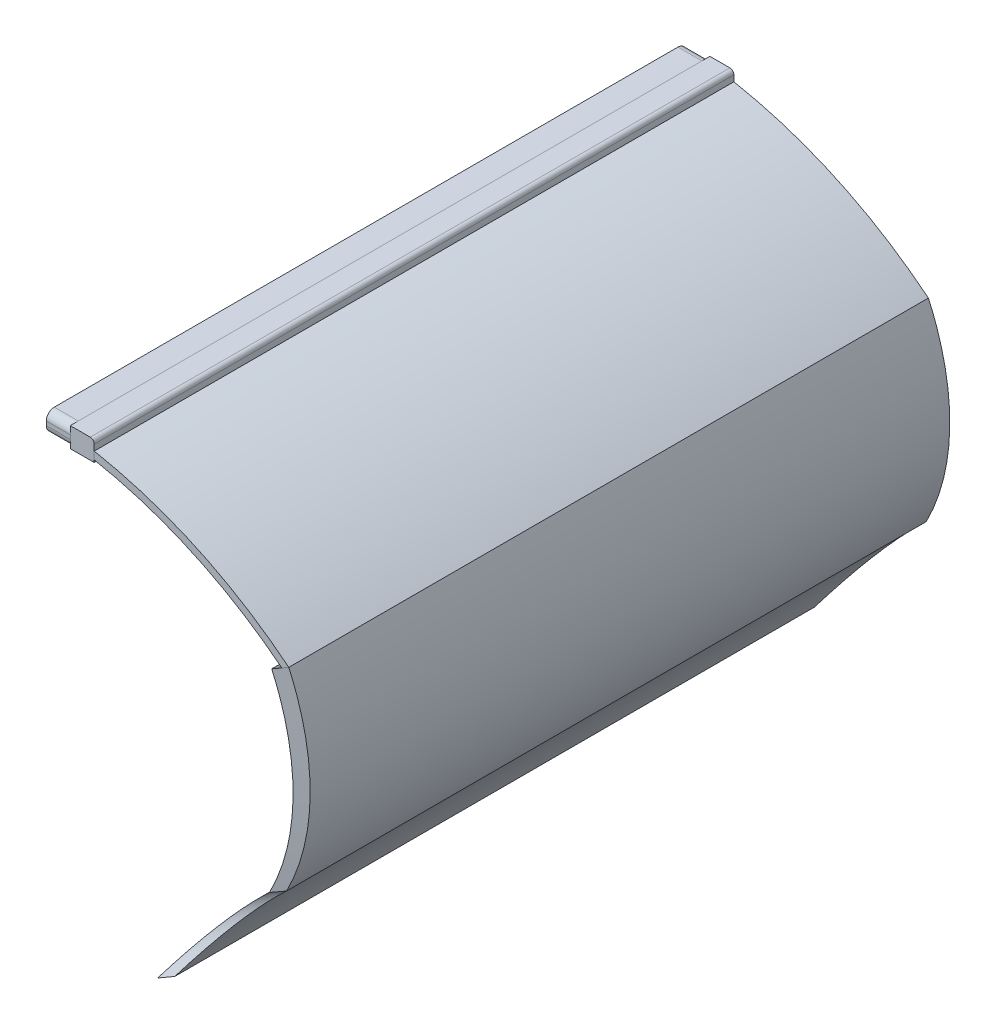
ISO-10303-21;
HEADER;
FILE_DESCRIPTION(('STEP AP214'),'2;1');
FILE_NAME('part.step','',(''),(''),'','','');
FILE_SCHEMA(('AUTOMOTIVE_DESIGN { 1 0 10303 214 1 1 1 1 }'));
ENDSEC;
DATA;
#1=APPLICATION_CONTEXT('core data for automotive mechanical design processes');
#2=APPLICATION_PROTOCOL_DEFINITION('international standard','automotive_design',2000,#1);
#3=PRODUCT_CONTEXT('',#1,'mechanical');
#4=PRODUCT('Part','Part','',(#3));
#5=PRODUCT_RELATED_PRODUCT_CATEGORY('part','',(#4));
#6=PRODUCT_DEFINITION_FORMATION('','',#4);
#7=PRODUCT_DEFINITION_CONTEXT('part definition',#1,'design');
#8=PRODUCT_DEFINITION('design','',#6,#7);
#9=PRODUCT_DEFINITION_SHAPE('','',#8);
#10=(LENGTH_UNIT() NAMED_UNIT(*) SI_UNIT(.MILLI.,.METRE.));
#11=(NAMED_UNIT(*) PLANE_ANGLE_UNIT() SI_UNIT($,.RADIAN.));
#12=(NAMED_UNIT(*) SI_UNIT($,.STERADIAN.) SOLID_ANGLE_UNIT());
#13=UNCERTAINTY_MEASURE_WITH_UNIT(LENGTH_MEASURE(1.E-05),#10,'distance_accuracy_value','');
#14=(GEOMETRIC_REPRESENTATION_CONTEXT(3) GLOBAL_UNCERTAINTY_ASSIGNED_CONTEXT((#13)) GLOBAL_UNIT_ASSIGNED_CONTEXT((#10,
#11,#12)) REPRESENTATION_CONTEXT('',''));
#15=CARTESIAN_POINT('',(0.,0.,0.));
#16=DIRECTION('',(0.,0.,1.));
#17=DIRECTION('',(1.,0.,0.));
#18=AXIS2_PLACEMENT_3D('',#15,#16,#17);
#19=CARTESIAN_POINT('',(26.1376134002085,-78.7658483279663,-80.));
#20=CARTESIAN_POINT('',(29.3737791130142,-73.8210922114999,-82.2996034340908));
#21=CARTESIAN_POINT('',(33.098124046671,-68.8330713909964,-83.8152619703646));
#22=CARTESIAN_POINT('',(41.2157217802528,-59.1820759257835,-85.1538805493582));
#23=CARTESIAN_POINT('',(45.607610375297,-54.5207231816037,-84.9766156301814));
#24=CARTESIAN_POINT('',(50.1514252787619,-50.2158761379638,-83.959956601666));
#25=CARTESIAN_POINT('',(26.1376134002085,-78.7658483279663,80.));
#26=CARTESIAN_POINT('',(29.3737791130142,-73.8210922114999,77.7003965659092));
#27=CARTESIAN_POINT('',(33.098124046671,-68.8330713909964,76.1847380296354));
#28=CARTESIAN_POINT('',(41.2157217802528,-59.1820759257835,74.8461194506418));
#29=CARTESIAN_POINT('',(45.607610375297,-54.5207231816037,75.0233843698186));
#30=CARTESIAN_POINT('',(50.1514252787619,-50.2158761379638,76.0400433983341));
#31=B_SPLINE_SURFACE_WITH_KNOTS('',1,3,((#19,#20,#21,#22,#23,#24),(#25,#26,#27,#28,#29,#30)),
.UNSPECIFIED.,.F.,.F.,.F.,(2,2),(4,2,4),(0.,1.),(0.,0.5,1.),.UNSPECIFIED.);
#32=DIRECTION('',(0.,0.,1.));
#33=VECTOR('',#32,1.);
#34=CARTESIAN_POINT('',(50.1514252787619,-50.2158761379638,76.0400433983341));
#35=LINE('',#34,#33);
#36=CARTESIAN_POINT('',(50.1514252787619,-50.2158761379638,-83.959956601666));
#37=VERTEX_POINT('',#36);
#38=CARTESIAN_POINT('',(50.1514252787619,-50.2158761379638,76.0400433983341));
#39=VERTEX_POINT('',#38);
#40=EDGE_CURVE('E14',#37,#39,#35,.T.);
#41=CARTESIAN_POINT('',(26.1376134002085,-78.7658483279663,-80.));
#42=CARTESIAN_POINT('',(29.3737791130142,-73.8210922114999,-82.2996034340908));
#43=CARTESIAN_POINT('',(33.098124046671,-68.8330713909964,-83.8152619703646));
#44=CARTESIAN_POINT('',(41.2157217802528,-59.1820759257835,-85.1538805493582));
#45=CARTESIAN_POINT('',(45.607610375297,-54.5207231816037,-84.9766156301814));
#46=CARTESIAN_POINT('',(50.1514252787619,-50.2158761379638,-83.959956601666));
#47=B_SPLINE_CURVE_WITH_KNOTS('',3,(#41,#42,#43,#44,#45,#46),.UNSPECIFIED.,.F.,.F.,(4,2,4),(0.,
0.5,1.),.UNSPECIFIED.);
#48=CARTESIAN_POINT('',(26.1376134002085,-78.7658483279663,-80.));
#49=VERTEX_POINT('',#48);
#50=EDGE_CURVE('E92',#49,#37,#47,.T.);
#51=DIRECTION('',(0.,0.,1.));
#52=VECTOR('',#51,1.);
#53=CARTESIAN_POINT('',(26.1376134002085,-78.7658483279663,80.));
#54=LINE('',#53,#52);
#55=CARTESIAN_POINT('',(26.1376134002085,-78.7658483279663,80.));
#56=VERTEX_POINT('',#55);
#57=EDGE_CURVE('E151',#49,#56,#54,.T.);
#58=CARTESIAN_POINT('',(26.1376134002085,-78.7658483279663,80.));
#59=CARTESIAN_POINT('',(29.3737791130142,-73.8210922114999,77.7003965659092));
#60=CARTESIAN_POINT('',(33.098124046671,-68.8330713909964,76.1847380296354));
#61=CARTESIAN_POINT('',(41.2157217802528,-59.1820759257835,74.8461194506418));
#62=CARTESIAN_POINT('',(45.607610375297,-54.5207231816037,75.0233843698186));
#63=CARTESIAN_POINT('',(50.1514252787619,-50.2158761379638,76.0400433983341));
#64=B_SPLINE_CURVE_WITH_KNOTS('',3,(#58,#59,#60,#61,#62,#63),.UNSPECIFIED.,.F.,.F.,(4,2,4),(0.,
0.5,1.),.UNSPECIFIED.);
#65=EDGE_CURVE('E157',#56,#39,#64,.T.);
#66=ORIENTED_EDGE('',*,*,#40,.F.);
#67=ORIENTED_EDGE('',*,*,#50,.F.);
#68=ORIENTED_EDGE('',*,*,#57,.T.);
#69=ORIENTED_EDGE('',*,*,#65,.T.);
#70=EDGE_LOOP('',(#66,#67,#68,#69));
#71=FACE_BOUND('',#70,.T.);
#72=ADVANCED_FACE('F82',(#71),#31,.T.);
#73=CARTESIAN_POINT('',(21.8623865997916,-81.2341516720336,-80.));
#74=CARTESIAN_POINT('',(25.0985523125973,-76.2893955555673,-82.2996034340908));
#75=CARTESIAN_POINT('',(28.822897246254,-71.3013747350638,-83.8152619703646));
#76=CARTESIAN_POINT('',(36.9404949798359,-61.6503792698509,-85.1538805493582));
#77=CARTESIAN_POINT('',(41.3323835748373,-56.9890265256236,-84.976615630191));
#78=CARTESIAN_POINT('',(45.876198478345,-52.6841794820312,-83.959956601666));
#79=CARTESIAN_POINT('',(26.1376134002085,-78.7658483279663,-80.));
#80=CARTESIAN_POINT('',(29.3737791130142,-73.8210922114999,-82.2996034340908));
#81=CARTESIAN_POINT('',(33.098124046671,-68.8330713909964,-83.8152619703646));
#82=CARTESIAN_POINT('',(41.2157217802528,-59.1820759257835,-85.1538805493582));
#83=CARTESIAN_POINT('',(45.607610375297,-54.5207231816037,-84.9766156301814));
#84=CARTESIAN_POINT('',(50.1514252787619,-50.2158761379638,-83.959956601666));
#85=B_SPLINE_SURFACE_WITH_KNOTS('',1,3,((#73,#74,#75,#76,#77,#78),(#79,#80,#81,#82,#83,#84)),
.UNSPECIFIED.,.F.,.F.,.F.,(2,2),(4,2,4),(0.,1.),(0.,0.5,1.),.UNSPECIFIED.);
#86=DIRECTION('',(0.866025403784442,0.499999999999994,0.));
#87=VECTOR('',#86,1.);
#88=CARTESIAN_POINT('',(50.1514252787619,-50.2158761379638,-83.959956601666));
#89=LINE('',#88,#87);
#90=CARTESIAN_POINT('',(45.876198478345,-52.6841794820312,-83.959956601666));
#91=VERTEX_POINT('',#90);
#92=EDGE_CURVE('E101',#91,#37,#89,.T.);
#93=CARTESIAN_POINT('',(21.8623865997916,-81.2341516720336,-80.));
#94=CARTESIAN_POINT('',(25.0985523125973,-76.2893955555673,-82.2996034340908));
#95=CARTESIAN_POINT('',(28.822897246254,-71.3013747350638,-83.8152619703646));
#96=CARTESIAN_POINT('',(36.9404949798359,-61.6503792698509,-85.1538805493582));
#97=CARTESIAN_POINT('',(41.3323835748801,-56.9890265256711,-84.9766156301814));
#98=CARTESIAN_POINT('',(45.876198478345,-52.6841794820312,-83.959956601666));
#99=B_SPLINE_CURVE_WITH_KNOTS('',3,(#93,#94,#95,#96,#97,#98),.UNSPECIFIED.,.F.,.F.,(4,2,4),(0.,
0.5,1.),.UNSPECIFIED.);
#100=CARTESIAN_POINT('',(21.8623865997916,-81.2341516720336,-80.));
#101=VERTEX_POINT('',#100);
#102=EDGE_CURVE('E149',#101,#91,#99,.T.);
#103=DIRECTION('',(0.866025403784442,0.499999999999994,0.));
#104=VECTOR('',#103,1.);
#105=CARTESIAN_POINT('',(26.1376134002085,-78.7658483279663,-80.));
#106=LINE('',#105,#104);
#107=EDGE_CURVE('E145',#101,#49,#106,.T.);
#108=ORIENTED_EDGE('',*,*,#50,.T.);
#109=ORIENTED_EDGE('',*,*,#92,.F.);
#110=ORIENTED_EDGE('',*,*,#102,.F.);
#111=ORIENTED_EDGE('',*,*,#107,.T.);
#112=EDGE_LOOP('',(#108,#109,#110,#111));
#113=FACE_BOUND('',#112,.T.);
#114=ADVANCED_FACE('F147',(#113),#85,.T.);
#115=CARTESIAN_POINT('',(21.8623865997916,-81.2341516720336,80.));
#116=CARTESIAN_POINT('',(25.0985523125973,-76.2893955555673,77.7003965659092));
#117=CARTESIAN_POINT('',(28.822897246254,-71.3013747350638,76.1847380296354));
#118=CARTESIAN_POINT('',(36.9404949798359,-61.6503792698509,74.8461194506418));
#119=CARTESIAN_POINT('',(41.3323835748801,-56.9890265256711,75.0233843698186));
#120=CARTESIAN_POINT('',(45.876198478345,-52.6841794820312,76.0400433983341));
#121=CARTESIAN_POINT('',(21.8623865997916,-81.2341516720336,-80.));
#122=CARTESIAN_POINT('',(25.0985523125973,-76.2893955555673,-82.2996034340908));
#123=CARTESIAN_POINT('',(28.822897246254,-71.3013747350638,-83.8152619703646));
#124=CARTESIAN_POINT('',(36.9404949798359,-61.6503792698509,-85.1538805493582));
#125=CARTESIAN_POINT('',(41.3323835748801,-56.9890265256711,-84.9766156301814));
#126=CARTESIAN_POINT('',(45.876198478345,-52.6841794820312,-83.959956601666));
#127=B_SPLINE_SURFACE_WITH_KNOTS('',1,3,((#115,#116,#117,#118,#119,#120),(#121,#122,#123,#124,
#125,#126)),.UNSPECIFIED.,.F.,.F.,.F.,(2,2),(4,2,4),(0.,1.),(0.,0.5,1.),.UNSPECIFIED.);
#128=DIRECTION('',(0.,0.,-1.));
#129=VECTOR('',#128,1.);
#130=CARTESIAN_POINT('',(45.876198478345,-52.6841794820312,76.0400433983341));
#131=LINE('',#130,#129);
#132=CARTESIAN_POINT('',(45.876198478345,-52.6841794820312,76.0400433983341));
#133=VERTEX_POINT('',#132);
#134=EDGE_CURVE('E225',#133,#91,#131,.T.);
#135=CARTESIAN_POINT('',(21.8623865997916,-81.2341516720336,80.));
#136=CARTESIAN_POINT('',(25.0985523125973,-76.2893955555673,77.7003965659092));
#137=CARTESIAN_POINT('',(28.822897246254,-71.3013747350638,76.1847380296354));
#138=CARTESIAN_POINT('',(36.9404949798359,-61.6503792698509,74.8461194506418));
#139=CARTESIAN_POINT('',(41.3323835748373,-56.9890265256236,75.023384369809));
#140=CARTESIAN_POINT('',(45.876198478345,-52.6841794820312,76.0400433983341));
#141=B_SPLINE_CURVE_WITH_KNOTS('',3,(#135,#136,#137,#138,#139,#140),.UNSPECIFIED.,.F.,.F.,(4,2,
4),(0.,0.5,1.),.UNSPECIFIED.);
#142=CARTESIAN_POINT('',(21.8623865997916,-81.2341516720336,80.));
#143=VERTEX_POINT('',#142);
#144=EDGE_CURVE('E221',#143,#133,#141,.T.);
#145=DIRECTION('',(0.,0.,-1.));
#146=VECTOR('',#145,1.);
#147=CARTESIAN_POINT('',(21.8623865997916,-81.2341516720336,80.));
#148=LINE('',#147,#146);
#149=EDGE_CURVE('E139',#143,#101,#148,.T.);
#150=ORIENTED_EDGE('',*,*,#102,.T.);
#151=ORIENTED_EDGE('',*,*,#134,.F.);
#152=ORIENTED_EDGE('',*,*,#144,.F.);
#153=ORIENTED_EDGE('',*,*,#149,.T.);
#154=EDGE_LOOP('',(#150,#151,#152,#153));
#155=FACE_BOUND('',#154,.T.);
#156=ADVANCED_FACE('F242',(#155),#127,.T.);
#157=CARTESIAN_POINT('',(26.1376134002085,-78.7658483279663,80.));
#158=CARTESIAN_POINT('',(29.3737791130142,-73.8210922114999,77.7003965659092));
#159=CARTESIAN_POINT('',(33.098124046671,-68.8330713909964,76.1847380296354));
#160=CARTESIAN_POINT('',(41.2157217802528,-59.1820759257835,74.8461194506418));
#161=CARTESIAN_POINT('',(45.607610375297,-54.5207231816037,75.0233843698186));
#162=CARTESIAN_POINT('',(50.1514252787619,-50.2158761379638,76.0400433983341));
#163=CARTESIAN_POINT('',(21.8623865997916,-81.2341516720336,80.));
#164=CARTESIAN_POINT('',(25.0985523125973,-76.2893955555673,77.7003965659092));
#165=CARTESIAN_POINT('',(28.822897246254,-71.3013747350638,76.1847380296354));
#166=CARTESIAN_POINT('',(36.9404949798359,-61.6503792698509,74.8461194506418));
#167=CARTESIAN_POINT('',(41.3323835748373,-56.9890265256236,75.023384369809));
#168=CARTESIAN_POINT('',(45.876198478345,-52.6841794820312,76.0400433983341));
#169=B_SPLINE_SURFACE_WITH_KNOTS('',1,3,((#157,#158,#159,#160,#161,#162),(#163,#164,#165,#166,
#167,#168)),.UNSPECIFIED.,.F.,.F.,.F.,(2,2),(4,2,4),(0.,1.),(0.,0.5,1.),.UNSPECIFIED.);
#170=DIRECTION('',(-0.866025403784442,-0.499999999999994,0.));
#171=VECTOR('',#170,1.);
#172=CARTESIAN_POINT('',(50.1514252787619,-50.2158761379638,76.0400433983341));
#173=LINE('',#172,#171);
#174=EDGE_CURVE('E219',#39,#133,#173,.T.);
#175=DIRECTION('',(-0.866025403784442,-0.499999999999994,0.));
#176=VECTOR('',#175,1.);
#177=CARTESIAN_POINT('',(26.1376134002085,-78.7658483279663,80.));
#178=LINE('',#177,#176);
#179=EDGE_CURVE('E125',#56,#143,#178,.T.);
#180=ORIENTED_EDGE('',*,*,#144,.T.);
#181=ORIENTED_EDGE('',*,*,#174,.F.);
#182=ORIENTED_EDGE('',*,*,#65,.F.);
#183=ORIENTED_EDGE('',*,*,#179,.T.);
#184=EDGE_LOOP('',(#180,#181,#182,#183));
#185=FACE_BOUND('',#184,.T.);
#186=ADVANCED_FACE('F246',(#185),#169,.T.);
#187=CARTESIAN_POINT('',(50.1514252787619,-50.2158761379638,-83.959956601666));
#188=CARTESIAN_POINT('',(54.5805588853691,-42.2832529813275,-83.3116461430407));
#189=CARTESIAN_POINT('',(57.2990518612734,-33.409821686223,-82.617487056354));
#190=CARTESIAN_POINT('',(58.8479201222226,-15.314329465085,-81.2573564708869));
#191=CARTESIAN_POINT('',(57.6771368751438,-6.10580371839242,-80.5924023311016));
#192=CARTESIAN_POINT('',(54.6608827975494,2.46830334406739,-80.));
#193=CARTESIAN_POINT('',(50.1514252787619,-50.2158761379638,76.0400433983341));
#194=CARTESIAN_POINT('',(54.5805588853691,-42.2832529813275,76.6883538569594));
#195=CARTESIAN_POINT('',(57.2990518612734,-33.409821686223,77.382512943646));
#196=CARTESIAN_POINT('',(58.8479201222226,-15.314329465085,78.7426435291131));
#197=CARTESIAN_POINT('',(57.6771368751438,-6.10580371839241,79.4075976688984));
#198=CARTESIAN_POINT('',(54.6608827975494,2.46830334406739,80.));
#199=B_SPLINE_SURFACE_WITH_KNOTS('',1,3,((#187,#188,#189,#190,#191,#192),(#193,#194,#195,#196,
#197,#198)),.UNSPECIFIED.,.F.,.F.,.F.,(2,2),(4,2,4),(0.,1.),(0.,0.5,1.),.UNSPECIFIED.);
#200=DIRECTION('',(0.,0.,1.));
#201=VECTOR('',#200,1.);
#202=CARTESIAN_POINT('',(54.6608827975494,2.46830334406739,80.));
#203=LINE('',#202,#201);
#204=CARTESIAN_POINT('',(54.6608827975494,2.46830334406739,-80.));
#205=VERTEX_POINT('',#204);
#206=CARTESIAN_POINT('',(54.6608827975494,2.46830334406739,80.));
#207=VERTEX_POINT('',#206);
#208=EDGE_CURVE('E87',#205,#207,#203,.T.);
#209=CARTESIAN_POINT('',(50.1514252787619,-50.2158761379638,-83.959956601666));
#210=CARTESIAN_POINT('',(54.5805588853691,-42.2832529813275,-83.3116461430407));
#211=CARTESIAN_POINT('',(57.2990518612734,-33.409821686223,-82.617487056354));
#212=CARTESIAN_POINT('',(58.8479201222226,-15.314329465085,-81.2573564708869));
#213=CARTESIAN_POINT('',(57.6771368751438,-6.10580371839242,-80.5924023311016));
#214=CARTESIAN_POINT('',(54.6608827975494,2.46830334406739,-80.));
#215=B_SPLINE_CURVE_WITH_KNOTS('',3,(#209,#210,#211,#212,#213,#214),.UNSPECIFIED.,.F.,.F.,(4,2,
4),(0.,0.5,1.),.UNSPECIFIED.);
#216=EDGE_CURVE('E200',#37,#205,#215,.T.);
#217=CARTESIAN_POINT('',(50.1514252787619,-50.2158761379638,76.0400433983341));
#218=CARTESIAN_POINT('',(54.5805588853691,-42.2832529813275,76.6883538569594));
#219=CARTESIAN_POINT('',(57.2990518612734,-33.409821686223,77.382512943646));
#220=CARTESIAN_POINT('',(58.8479201222226,-15.314329465085,78.7426435291131));
#221=CARTESIAN_POINT('',(57.6771368751438,-6.10580371839241,79.4075976688984));
#222=CARTESIAN_POINT('',(54.6608827975494,2.46830334406739,80.));
#223=B_SPLINE_CURVE_WITH_KNOTS('',3,(#217,#218,#219,#220,#221,#222),.UNSPECIFIED.,.F.,.F.,(4,2,
4),(0.,0.5,1.),.UNSPECIFIED.);
#224=EDGE_CURVE('E173',#39,#207,#223,.T.);
#225=ORIENTED_EDGE('',*,*,#208,.F.);
#226=ORIENTED_EDGE('',*,*,#216,.F.);
#227=ORIENTED_EDGE('',*,*,#40,.T.);
#228=ORIENTED_EDGE('',*,*,#224,.T.);
#229=EDGE_LOOP('',(#225,#226,#227,#228));
#230=FACE_BOUND('',#229,.T.);
#231=ADVANCED_FACE('F83',(#230),#199,.T.);
#232=CARTESIAN_POINT('',(45.876198478345,-52.6841794820312,-83.959956601666));
#233=CARTESIAN_POINT('',(50.3053320849522,-44.7515563253949,-83.3116461430407));
#234=CARTESIAN_POINT('',(53.0238250608565,-35.8781250302904,-82.617487056354));
#235=CARTESIAN_POINT('',(54.5726933218056,-17.7826328091524,-81.2573564708869));
#236=CARTESIAN_POINT('',(53.4019100747272,-8.5741070624597,-80.5924023311017));
#237=CARTESIAN_POINT('',(50.3856559971324,0.,-80.));
#238=CARTESIAN_POINT('',(50.1514252787619,-50.2158761379638,-83.959956601666));
#239=CARTESIAN_POINT('',(54.5805588853691,-42.2832529813275,-83.3116461430407));
#240=CARTESIAN_POINT('',(57.2990518612734,-33.409821686223,-82.617487056354));
#241=CARTESIAN_POINT('',(58.8479201222226,-15.314329465085,-81.2573564708869));
#242=CARTESIAN_POINT('',(57.6771368751438,-6.10580371839242,-80.5924023311016));
#243=CARTESIAN_POINT('',(54.6608827975494,2.46830334406739,-80.));
#244=B_SPLINE_SURFACE_WITH_KNOTS('',1,3,((#232,#233,#234,#235,#236,#237),(#238,#239,#240,#241,
#242,#243)),.UNSPECIFIED.,.F.,.F.,.F.,(2,2),(4,2,4),(0.,1.),(0.,0.5,1.),.UNSPECIFIED.);
#245=DIRECTION('',(0.866025403784442,0.499999999999994,0.));
#246=VECTOR('',#245,1.);
#247=CARTESIAN_POINT('',(54.6608827975494,2.46830334406739,-80.));
#248=LINE('',#247,#246);
#249=CARTESIAN_POINT('',(50.3856559971324,0.,-80.));
#250=VERTEX_POINT('',#249);
#251=EDGE_CURVE('E117',#250,#205,#248,.T.);
#252=CARTESIAN_POINT('',(45.876198478345,-52.6841794820312,-83.959956601666));
#253=CARTESIAN_POINT('',(50.3053320849522,-44.7515563253949,-83.3116461430407));
#254=CARTESIAN_POINT('',(53.0238250608565,-35.8781250302904,-82.617487056354));
#255=CARTESIAN_POINT('',(54.5726933218056,-17.7826328091524,-81.2573564708869));
#256=CARTESIAN_POINT('',(53.4019100747272,-8.5741070624597,-80.5924023311017));
#257=CARTESIAN_POINT('',(50.3856559971324,0.,-80.));
#258=B_SPLINE_CURVE_WITH_KNOTS('',3,(#252,#253,#254,#255,#256,#257),.UNSPECIFIED.,.F.,.F.,(4,2,
4),(0.,0.5,1.),.UNSPECIFIED.);
#259=EDGE_CURVE('E191',#91,#250,#258,.T.);
#260=ORIENTED_EDGE('',*,*,#216,.T.);
#261=ORIENTED_EDGE('',*,*,#251,.F.);
#262=ORIENTED_EDGE('',*,*,#259,.F.);
#263=ORIENTED_EDGE('',*,*,#92,.T.);
#264=EDGE_LOOP('',(#260,#261,#262,#263));
#265=FACE_BOUND('',#264,.T.);
#266=ADVANCED_FACE('F251',(#265),#244,.T.);
#267=CARTESIAN_POINT('',(45.876198478345,-52.6841794820312,76.0400433983341));
#268=CARTESIAN_POINT('',(50.3053320849522,-44.7515563253949,76.6883538569593));
#269=CARTESIAN_POINT('',(53.0238250608565,-35.8781250302904,77.382512943646));
#270=CARTESIAN_POINT('',(54.5726933218056,-17.7826328091524,78.7426435291131));
#271=CARTESIAN_POINT('',(53.4019100747272,-8.57410706245969,79.4075976688984));
#272=CARTESIAN_POINT('',(50.3856559971324,0.,80.));
#273=CARTESIAN_POINT('',(45.876198478345,-52.6841794820312,-83.959956601666));
#274=CARTESIAN_POINT('',(50.3053320849522,-44.7515563253949,-83.3116461430407));
#275=CARTESIAN_POINT('',(53.0238250608565,-35.8781250302904,-82.617487056354));
#276=CARTESIAN_POINT('',(54.5726933218056,-17.7826328091524,-81.2573564708869));
#277=CARTESIAN_POINT('',(53.4019100747272,-8.5741070624597,-80.5924023311017));
#278=CARTESIAN_POINT('',(50.3856559971324,0.,-80.));
#279=B_SPLINE_SURFACE_WITH_KNOTS('',1,3,((#267,#268,#269,#270,#271,#272),(#273,#274,#275,#276,
#277,#278)),.UNSPECIFIED.,.F.,.F.,.F.,(2,2),(4,2,4),(0.,1.),(0.,0.5,1.),.UNSPECIFIED.);
#280=DIRECTION('',(0.,0.,-1.));
#281=VECTOR('',#280,1.);
#282=CARTESIAN_POINT('',(50.3856559971324,0.,80.));
#283=LINE('',#282,#281);
#284=CARTESIAN_POINT('',(50.3856559971324,0.,80.));
#285=VERTEX_POINT('',#284);
#286=EDGE_CURVE('E178',#285,#250,#283,.T.);
#287=CARTESIAN_POINT('',(45.876198478345,-52.6841794820312,76.0400433983341));
#288=CARTESIAN_POINT('',(50.3053320849522,-44.7515563253949,76.6883538569594));
#289=CARTESIAN_POINT('',(53.0238250608565,-35.8781250302904,77.382512943646));
#290=CARTESIAN_POINT('',(54.5726933218056,-17.7826328091524,78.7426435291131));
#291=CARTESIAN_POINT('',(53.4019100747272,-8.57410706245969,79.4075976688984));
#292=CARTESIAN_POINT('',(50.3856559971324,0.,80.));
#293=B_SPLINE_CURVE_WITH_KNOTS('',3,(#287,#288,#289,#290,#291,#292),.UNSPECIFIED.,.F.,.F.,(4,2,
4),(0.,0.5,1.),.UNSPECIFIED.);
#294=EDGE_CURVE('E172',#133,#285,#293,.T.);
#295=ORIENTED_EDGE('',*,*,#259,.T.);
#296=ORIENTED_EDGE('',*,*,#286,.F.);
#297=ORIENTED_EDGE('',*,*,#294,.F.);
#298=ORIENTED_EDGE('',*,*,#134,.T.);
#299=EDGE_LOOP('',(#295,#296,#297,#298));
#300=FACE_BOUND('',#299,.T.);
#301=ADVANCED_FACE('F250',(#300),#279,.T.);
#302=CARTESIAN_POINT('',(50.1514252787619,-50.2158761379638,76.0400433983341));
#303=CARTESIAN_POINT('',(54.5805588853691,-42.2832529813275,76.6883538569594));
#304=CARTESIAN_POINT('',(57.2990518612734,-33.409821686223,77.382512943646));
#305=CARTESIAN_POINT('',(58.8479201222226,-15.314329465085,78.7426435291131));
#306=CARTESIAN_POINT('',(57.6771368751438,-6.10580371839241,79.4075976688984));
#307=CARTESIAN_POINT('',(54.6608827975494,2.46830334406739,80.));
#308=CARTESIAN_POINT('',(45.876198478345,-52.6841794820312,76.0400433983341));
#309=CARTESIAN_POINT('',(50.3053320849522,-44.7515563253949,76.6883538569594));
#310=CARTESIAN_POINT('',(53.0238250608565,-35.8781250302904,77.382512943646));
#311=CARTESIAN_POINT('',(54.5726933218056,-17.7826328091524,78.7426435291131));
#312=CARTESIAN_POINT('',(53.4019100747272,-8.57410706245969,79.4075976688984));
#313=CARTESIAN_POINT('',(50.3856559971324,0.,80.));
#314=B_SPLINE_SURFACE_WITH_KNOTS('',1,3,((#302,#303,#304,#305,#306,#307),(#308,#309,#310,#311,
#312,#313)),.UNSPECIFIED.,.F.,.F.,.F.,(2,2),(4,2,4),(0.,1.),(0.,0.5,1.),.UNSPECIFIED.);
#315=DIRECTION('',(-0.866025403784442,-0.499999999999994,0.));
#316=VECTOR('',#315,1.);
#317=CARTESIAN_POINT('',(54.6608827975494,2.46830334406739,80.));
#318=LINE('',#317,#316);
#319=EDGE_CURVE('E168',#207,#285,#318,.T.);
#320=ORIENTED_EDGE('',*,*,#294,.T.);
#321=ORIENTED_EDGE('',*,*,#319,.F.);
#322=ORIENTED_EDGE('',*,*,#224,.F.);
#323=ORIENTED_EDGE('',*,*,#174,.T.);
#324=EDGE_LOOP('',(#320,#321,#322,#323));
#325=FACE_BOUND('',#324,.T.);
#326=ADVANCED_FACE('F249',(#325),#314,.T.);
#327=OPEN_SHELL('',(#72,#114,#156,#186,#231,#266,#301,#326));
#328=SHELL_BASED_SURFACE_MODEL('B2',(#327));
#329=CARTESIAN_POINT('',(-6.,24.5,78.));
#330=DIRECTION('',(1.,0.,0.));
#331=DIRECTION('',(0.,0.,-1.));
#332=AXIS2_PLACEMENT_3D('',#329,#330,#331);
#333=CYLINDRICAL_SURFACE('',#332,2.);
#334=CARTESIAN_POINT('',(0.,24.5,78.));
#335=DIRECTION('',(1.,0.,0.));
#336=DIRECTION('',(0.,0.,1.));
#337=AXIS2_PLACEMENT_3D('',#334,#335,#336);
#338=CIRCLE('',#337,2.);
#339=CARTESIAN_POINT('',(0.,24.5,80.));
#340=VERTEX_POINT('',#339);
#341=CARTESIAN_POINT('',(0.,22.5,78.));
#342=VERTEX_POINT('',#341);
#343=EDGE_CURVE('E480',#340,#342,#338,.T.);
#344=ORIENTED_EDGE('',*,*,#343,.F.);
#345=DIRECTION('',(1.,0.,0.));
#346=VECTOR('',#345,1.);
#347=CARTESIAN_POINT('',(-6.,24.5,80.));
#348=LINE('',#347,#346);
#349=CARTESIAN_POINT('',(-6.,24.5,80.));
#350=VERTEX_POINT('',#349);
#351=EDGE_CURVE('E80',#350,#340,#348,.T.);
#352=ORIENTED_EDGE('',*,*,#351,.F.);
#353=CARTESIAN_POINT('',(-6.,24.5,78.));
#354=DIRECTION('',(1.,0.,0.));
#355=DIRECTION('',(0.,0.,1.));
#356=AXIS2_PLACEMENT_3D('',#353,#354,#355);
#357=CIRCLE('',#356,2.);
#358=CARTESIAN_POINT('',(-6.,22.5,78.));
#359=VERTEX_POINT('',#358);
#360=EDGE_CURVE('E508',#350,#359,#357,.T.);
#361=ORIENTED_EDGE('',*,*,#360,.T.);
#362=DIRECTION('',(1.,0.,0.));
#363=VECTOR('',#362,1.);
#364=CARTESIAN_POINT('',(-6.,22.5,78.));
#365=LINE('',#364,#363);
#366=EDGE_CURVE('E380',#359,#342,#365,.T.);
#367=ORIENTED_EDGE('',*,*,#366,.T.);
#368=EDGE_LOOP('',(#344,#352,#361,#367));
#369=FACE_BOUND('',#368,.T.);
#370=ADVANCED_FACE('F377',(#369),#333,.T.);
#371=CARTESIAN_POINT('',(-6.,25.5,80.));
#372=DIRECTION('',(0.,0.,1.));
#373=DIRECTION('',(1.,0.,0.));
#374=AXIS2_PLACEMENT_3D('',#371,#372,#373);
#375=PLANE('',#374);
#376=DIRECTION('',(0.,-1.,0.));
#377=VECTOR('',#376,1.);
#378=CARTESIAN_POINT('',(0.,25.5,80.));
#379=LINE('',#378,#377);
#380=CARTESIAN_POINT('',(0.,25.5,80.));
#381=VERTEX_POINT('',#380);
#382=EDGE_CURVE('E505',#381,#340,#379,.T.);
#383=ORIENTED_EDGE('',*,*,#382,.F.);
#384=DIRECTION('',(1.,0.,0.));
#385=VECTOR('',#384,1.);
#386=CARTESIAN_POINT('',(-6.,25.5,80.));
#387=LINE('',#386,#385);
#388=CARTESIAN_POINT('',(-6.,25.5,80.));
#389=VERTEX_POINT('',#388);
#390=EDGE_CURVE('E387',#389,#381,#387,.T.);
#391=ORIENTED_EDGE('',*,*,#390,.F.);
#392=DIRECTION('',(0.,-1.,0.));
#393=VECTOR('',#392,1.);
#394=CARTESIAN_POINT('',(-6.,25.5,80.));
#395=LINE('',#394,#393);
#396=EDGE_CURVE('E466',#389,#350,#395,.T.);
#397=ORIENTED_EDGE('',*,*,#396,.T.);
#398=ORIENTED_EDGE('',*,*,#351,.T.);
#399=EDGE_LOOP('',(#383,#391,#397,#398));
#400=FACE_BOUND('',#399,.T.);
#401=ADVANCED_FACE('F526',(#400),#375,.T.);
#402=CARTESIAN_POINT('',(-6.,25.5,78.));
#403=DIRECTION('',(1.,0.,0.));
#404=DIRECTION('',(0.,0.,-1.));
#405=AXIS2_PLACEMENT_3D('',#402,#403,#404);
#406=CYLINDRICAL_SURFACE('',#405,2.);
#407=CARTESIAN_POINT('',(0.,25.5,78.));
#408=DIRECTION('',(1.,0.,0.));
#409=DIRECTION('',(0.,0.,1.));
#410=AXIS2_PLACEMENT_3D('',#407,#408,#409);
#411=CIRCLE('',#410,2.);
#412=CARTESIAN_POINT('',(0.,27.5,78.));
#413=VERTEX_POINT('',#412);
#414=EDGE_CURVE('E452',#413,#381,#411,.T.);
#415=ORIENTED_EDGE('',*,*,#414,.F.);
#416=DIRECTION('',(1.,0.,0.));
#417=VECTOR('',#416,1.);
#418=CARTESIAN_POINT('',(-6.,27.5,78.));
#419=LINE('',#418,#417);
#420=CARTESIAN_POINT('',(-6.,27.5,78.));
#421=VERTEX_POINT('',#420);
#422=EDGE_CURVE('E447',#421,#413,#419,.T.);
#423=ORIENTED_EDGE('',*,*,#422,.F.);
#424=CARTESIAN_POINT('',(-6.,25.5,78.));
#425=DIRECTION('',(1.,0.,0.));
#426=DIRECTION('',(0.,0.,1.));
#427=AXIS2_PLACEMENT_3D('',#424,#425,#426);
#428=CIRCLE('',#427,2.);
#429=EDGE_CURVE('E450',#421,#389,#428,.T.);
#430=ORIENTED_EDGE('',*,*,#429,.T.);
#431=ORIENTED_EDGE('',*,*,#390,.T.);
#432=EDGE_LOOP('',(#415,#423,#430,#431));
#433=FACE_BOUND('',#432,.T.);
#434=ADVANCED_FACE('F449',(#433),#406,.T.);
#435=CARTESIAN_POINT('',(-6.,27.5,-78.));
#436=DIRECTION('',(0.,1.,0.));
#437=DIRECTION('',(0.,0.,1.));
#438=AXIS2_PLACEMENT_3D('',#435,#436,#437);
#439=PLANE('',#438);
#440=DIRECTION('',(0.,0.,1.));
#441=VECTOR('',#440,1.);
#442=CARTESIAN_POINT('',(0.,27.5,-78.));
#443=LINE('',#442,#441);
#444=CARTESIAN_POINT('',(0.,27.5,-78.));
#445=VERTEX_POINT('',#444);
#446=EDGE_CURVE('E500',#445,#413,#443,.T.);
#447=ORIENTED_EDGE('',*,*,#446,.F.);
#448=DIRECTION('',(1.,0.,0.));
#449=VECTOR('',#448,1.);
#450=CARTESIAN_POINT('',(-6.,27.5,-78.));
#451=LINE('',#450,#449);
#452=CARTESIAN_POINT('',(-6.,27.5,-78.));
#453=VERTEX_POINT('',#452);
#454=EDGE_CURVE('E458',#453,#445,#451,.T.);
#455=ORIENTED_EDGE('',*,*,#454,.F.);
#456=DIRECTION('',(0.,0.,1.));
#457=VECTOR('',#456,1.);
#458=CARTESIAN_POINT('',(-6.,27.5,-78.));
#459=LINE('',#458,#457);
#460=EDGE_CURVE('E464',#453,#421,#459,.T.);
#461=ORIENTED_EDGE('',*,*,#460,.T.);
#462=ORIENTED_EDGE('',*,*,#422,.T.);
#463=EDGE_LOOP('',(#447,#455,#461,#462));
#464=FACE_BOUND('',#463,.T.);
#465=ADVANCED_FACE('F469',(#464),#439,.T.);
#466=CARTESIAN_POINT('',(-6.,25.5,-78.));
#467=DIRECTION('',(1.,0.,0.));
#468=DIRECTION('',(0.,0.,-1.));
#469=AXIS2_PLACEMENT_3D('',#466,#467,#468);
#470=CYLINDRICAL_SURFACE('',#469,2.);
#471=CARTESIAN_POINT('',(0.,25.5,-78.));
#472=DIRECTION('',(1.,0.,0.));
#473=DIRECTION('',(0.,0.,-1.));
#474=AXIS2_PLACEMENT_3D('',#471,#472,#473);
#475=CIRCLE('',#474,2.);
#476=CARTESIAN_POINT('',(0.,25.5,-80.));
#477=VERTEX_POINT('',#476);
#478=EDGE_CURVE('E496',#477,#445,#475,.T.);
#479=ORIENTED_EDGE('',*,*,#478,.F.);
#480=DIRECTION('',(1.,0.,0.));
#481=VECTOR('',#480,1.);
#482=CARTESIAN_POINT('',(-6.,25.5,-80.));
#483=LINE('',#482,#481);
#484=CARTESIAN_POINT('',(-6.,25.5,-80.));
#485=VERTEX_POINT('',#484);
#486=EDGE_CURVE('E514',#485,#477,#483,.T.);
#487=ORIENTED_EDGE('',*,*,#486,.F.);
#488=CARTESIAN_POINT('',(-6.,25.5,-78.));
#489=DIRECTION('',(1.,0.,0.));
#490=DIRECTION('',(0.,0.,-1.));
#491=AXIS2_PLACEMENT_3D('',#488,#489,#490);
#492=CIRCLE('',#491,2.);
#493=EDGE_CURVE('E471',#485,#453,#492,.T.);
#494=ORIENTED_EDGE('',*,*,#493,.T.);
#495=ORIENTED_EDGE('',*,*,#454,.T.);
#496=EDGE_LOOP('',(#479,#487,#494,#495));
#497=FACE_BOUND('',#496,.T.);
#498=ADVANCED_FACE('F539',(#497),#470,.T.);
#499=CARTESIAN_POINT('',(-6.,24.5,-80.));
#500=DIRECTION('',(0.,0.,-1.));
#501=DIRECTION('',(-1.,0.,0.));
#502=AXIS2_PLACEMENT_3D('',#499,#500,#501);
#503=PLANE('',#502);
#504=DIRECTION('',(0.,1.,0.));
#505=VECTOR('',#504,1.);
#506=CARTESIAN_POINT('',(0.,24.5,-80.));
#507=LINE('',#506,#505);
#508=CARTESIAN_POINT('',(0.,24.5,-80.));
#509=VERTEX_POINT('',#508);
#510=EDGE_CURVE('E492',#509,#477,#507,.T.);
#511=ORIENTED_EDGE('',*,*,#510,.F.);
#512=DIRECTION('',(1.,0.,0.));
#513=VECTOR('',#512,1.);
#514=CARTESIAN_POINT('',(-6.,24.5,-80.));
#515=LINE('',#514,#513);
#516=CARTESIAN_POINT('',(-6.,24.5,-80.));
#517=VERTEX_POINT('',#516);
#518=EDGE_CURVE('E517',#517,#509,#515,.T.);
#519=ORIENTED_EDGE('',*,*,#518,.F.);
#520=DIRECTION('',(0.,1.,0.));
#521=VECTOR('',#520,1.);
#522=CARTESIAN_POINT('',(-6.,24.5,-80.));
#523=LINE('',#522,#521);
#524=EDGE_CURVE('E474',#517,#485,#523,.T.);
#525=ORIENTED_EDGE('',*,*,#524,.T.);
#526=ORIENTED_EDGE('',*,*,#486,.T.);
#527=EDGE_LOOP('',(#511,#519,#525,#526));
#528=FACE_BOUND('',#527,.T.);
#529=ADVANCED_FACE('F542',(#528),#503,.T.);
#530=CARTESIAN_POINT('',(-6.,24.5,-78.));
#531=DIRECTION('',(1.,0.,0.));
#532=DIRECTION('',(0.,0.,-1.));
#533=AXIS2_PLACEMENT_3D('',#530,#531,#532);
#534=CYLINDRICAL_SURFACE('',#533,2.);
#535=CARTESIAN_POINT('',(0.,24.5,-78.));
#536=DIRECTION('',(1.,0.,0.));
#537=DIRECTION('',(0.,0.,-1.));
#538=AXIS2_PLACEMENT_3D('',#535,#536,#537);
#539=CIRCLE('',#538,2.);
#540=CARTESIAN_POINT('',(0.,22.5,-78.));
#541=VERTEX_POINT('',#540);
#542=EDGE_CURVE('E488',#541,#509,#539,.T.);
#543=ORIENTED_EDGE('',*,*,#542,.F.);
#544=DIRECTION('',(1.,0.,0.));
#545=VECTOR('',#544,1.);
#546=CARTESIAN_POINT('',(-6.,22.5,-78.));
#547=LINE('',#546,#545);
#548=CARTESIAN_POINT('',(-6.,22.5,-78.));
#549=VERTEX_POINT('',#548);
#550=EDGE_CURVE('E519',#549,#541,#547,.T.);
#551=ORIENTED_EDGE('',*,*,#550,.F.);
#552=CARTESIAN_POINT('',(-6.,24.5,-78.));
#553=DIRECTION('',(1.,0.,0.));
#554=DIRECTION('',(0.,0.,-1.));
#555=AXIS2_PLACEMENT_3D('',#552,#553,#554);
#556=CIRCLE('',#555,2.);
#557=EDGE_CURVE('E617',#549,#517,#556,.T.);
#558=ORIENTED_EDGE('',*,*,#557,.T.);
#559=ORIENTED_EDGE('',*,*,#518,.T.);
#560=EDGE_LOOP('',(#543,#551,#558,#559));
#561=FACE_BOUND('',#560,.T.);
#562=ADVANCED_FACE('F546',(#561),#534,.T.);
#563=CARTESIAN_POINT('',(-6.,22.5,78.));
#564=DIRECTION('',(0.,-1.,0.));
#565=DIRECTION('',(0.,0.,-1.));
#566=AXIS2_PLACEMENT_3D('',#563,#564,#565);
#567=PLANE('',#566);
#568=DIRECTION('',(0.,0.,-1.));
#569=VECTOR('',#568,1.);
#570=CARTESIAN_POINT('',(0.,22.5,78.));
#571=LINE('',#570,#569);
#572=EDGE_CURVE('E484',#342,#541,#571,.T.);
#573=ORIENTED_EDGE('',*,*,#572,.F.);
#574=ORIENTED_EDGE('',*,*,#366,.F.);
#575=DIRECTION('',(0.,0.,-1.));
#576=VECTOR('',#575,1.);
#577=CARTESIAN_POINT('',(-6.,22.5,78.));
#578=LINE('',#577,#576);
#579=EDGE_CURVE('E620',#359,#549,#578,.T.);
#580=ORIENTED_EDGE('',*,*,#579,.T.);
#581=ORIENTED_EDGE('',*,*,#550,.T.);
#582=EDGE_LOOP('',(#573,#574,#580,#581));
#583=FACE_BOUND('',#582,.T.);
#584=ADVANCED_FACE('F523',(#583),#567,.T.);
#585=CARTESIAN_POINT('',(-6.,24.5,78.));
#586=DIRECTION('',(-1.,0.,0.));
#587=DIRECTION('',(0.,0.,1.));
#588=AXIS2_PLACEMENT_3D('',#585,#586,#587);
#589=PLANE('',#588);
#590=ORIENTED_EDGE('',*,*,#360,.F.);
#591=ORIENTED_EDGE('',*,*,#396,.F.);
#592=ORIENTED_EDGE('',*,*,#429,.F.);
#593=ORIENTED_EDGE('',*,*,#460,.F.);
#594=ORIENTED_EDGE('',*,*,#493,.F.);
#595=ORIENTED_EDGE('',*,*,#524,.F.);
#596=ORIENTED_EDGE('',*,*,#557,.F.);
#597=ORIENTED_EDGE('',*,*,#579,.F.);
#598=EDGE_LOOP('',(#590,#591,#592,#593,#594,#595,#596,#597));
#599=FACE_BOUND('',#598,.T.);
#600=ADVANCED_FACE('F462',(#599),#589,.T.);
#601=CARTESIAN_POINT('',(0.,24.5,78.));
#602=DIRECTION('',(-1.,0.,0.));
#603=DIRECTION('',(0.,0.,1.));
#604=AXIS2_PLACEMENT_3D('',#601,#602,#603);
#605=PLANE('',#604);
#606=ORIENTED_EDGE('',*,*,#343,.T.);
#607=ORIENTED_EDGE('',*,*,#572,.T.);
#608=ORIENTED_EDGE('',*,*,#542,.T.);
#609=ORIENTED_EDGE('',*,*,#510,.T.);
#610=ORIENTED_EDGE('',*,*,#478,.T.);
#611=ORIENTED_EDGE('',*,*,#446,.T.);
#612=ORIENTED_EDGE('',*,*,#414,.T.);
#613=ORIENTED_EDGE('',*,*,#382,.T.);
#614=EDGE_LOOP('',(#606,#607,#608,#609,#610,#611,#612,#613));
#615=FACE_BOUND('',#614,.T.);
#616=ADVANCED_FACE('F525',(#615),#605,.F.);
#617=CLOSED_SHELL('',(#370,#401,#434,#465,#498,#529,#562,#584,#600,#616));
#618=MANIFOLD_SOLID_BREP('B8',#617);
#619=CARTESIAN_POINT('',(0.,27.5,-80.));
#620=CARTESIAN_POINT('',(0.,25.8333333333333,-80.));
#621=CARTESIAN_POINT('',(0.,24.1666666666667,-80.));
#622=CARTESIAN_POINT('',(0.,22.5,-80.));
#623=CARTESIAN_POINT('',(0.,27.5,-26.6666666666667));
#624=CARTESIAN_POINT('',(0.,25.8333333333333,-26.6666666666667));
#625=CARTESIAN_POINT('',(0.,24.1666666666667,-26.6666666666667));
#626=CARTESIAN_POINT('',(0.,22.5,-26.6666666666667));
#627=CARTESIAN_POINT('',(0.,27.5,26.6666666666667));
#628=CARTESIAN_POINT('',(0.,25.8333333333333,26.6666666666667));
#629=CARTESIAN_POINT('',(0.,24.1666666666667,26.6666666666667));
#630=CARTESIAN_POINT('',(0.,22.5,26.6666666666667));
#631=CARTESIAN_POINT('',(0.,27.5,80.));
#632=CARTESIAN_POINT('',(0.,25.8333333333333,80.));
#633=CARTESIAN_POINT('',(0.,24.1666666666667,80.));
#634=CARTESIAN_POINT('',(0.,22.5,80.));
#635=B_SPLINE_SURFACE_WITH_KNOTS('',3,3,((#619,#620,#621,#622),(#623,#624,#625,#626),(#627,#628,
#629,#630),(#631,#632,#633,#634)),.UNSPECIFIED.,.F.,.F.,.F.,(4,4),(4,4),(0.,1.),(0.,1.),.UNSPECIFIED.);
#636=CARTESIAN_POINT('',(0.,27.5,-80.));
#637=CARTESIAN_POINT('',(0.,27.5,-26.6666666666667));
#638=CARTESIAN_POINT('',(0.,27.5,26.6666666666667));
#639=CARTESIAN_POINT('',(0.,27.5,80.));
#640=B_SPLINE_CURVE_WITH_KNOTS('',3,(#636,#637,#638,#639),.UNSPECIFIED.,.F.,.F.,(4,4),(0.,1.),.UNSPECIFIED.);
#641=CARTESIAN_POINT('',(0.,27.5,-80.));
#642=VERTEX_POINT('',#641);
#643=CARTESIAN_POINT('',(0.,27.5,80.));
#644=VERTEX_POINT('',#643);
#645=EDGE_CURVE('E375',#642,#644,#640,.T.);
#646=CARTESIAN_POINT('',(0.,27.5,80.));
#647=CARTESIAN_POINT('',(0.,25.8333333333333,80.));
#648=CARTESIAN_POINT('',(0.,24.1666666666667,80.));
#649=CARTESIAN_POINT('',(0.,22.5,80.));
#650=B_SPLINE_CURVE_WITH_KNOTS('',3,(#646,#647,#648,#649),.UNSPECIFIED.,.F.,.F.,(4,4),(0.,1.),.UNSPECIFIED.);
#651=CARTESIAN_POINT('',(0.,22.5,80.));
#652=VERTEX_POINT('',#651);
#653=EDGE_CURVE('E649',#644,#652,#650,.T.);
#654=CARTESIAN_POINT('',(0.,22.5,-80.));
#655=CARTESIAN_POINT('',(0.,22.5,-26.6666666666667));
#656=CARTESIAN_POINT('',(0.,22.5,26.6666666666667));
#657=CARTESIAN_POINT('',(0.,22.5,80.));
#658=B_SPLINE_CURVE_WITH_KNOTS('',3,(#654,#655,#656,#657),.UNSPECIFIED.,.F.,.F.,(4,4),(0.,1.),.UNSPECIFIED.);
#659=CARTESIAN_POINT('',(0.,22.5,-80.));
#660=VERTEX_POINT('',#659);
#661=EDGE_CURVE('E657',#652,#660,#658,.F.);
#662=CARTESIAN_POINT('',(0.,27.5,-80.));
#663=CARTESIAN_POINT('',(0.,25.8333333333333,-80.));
#664=CARTESIAN_POINT('',(0.,24.1666666666667,-80.));
#665=CARTESIAN_POINT('',(0.,22.5,-80.));
#666=B_SPLINE_CURVE_WITH_KNOTS('',3,(#662,#663,#664,#665),.UNSPECIFIED.,.F.,.F.,(4,4),(0.,1.),.UNSPECIFIED.);
#667=EDGE_CURVE('E641',#660,#642,#666,.F.);
#668=ORIENTED_EDGE('',*,*,#645,.T.);
#669=ORIENTED_EDGE('',*,*,#653,.T.);
#670=ORIENTED_EDGE('',*,*,#661,.T.);
#671=ORIENTED_EDGE('',*,*,#667,.T.);
#672=EDGE_LOOP('',(#668,#669,#670,#671));
#673=FACE_BOUND('',#672,.T.);
#674=ADVANCED_FACE('F638',(#673),#635,.T.);
#675=OPEN_SHELL('',(#674));
#676=SHELL_BASED_SURFACE_MODEL('B74',(#675));
#677=CARTESIAN_POINT('',(6.,27.5,-80.));
#678=DIRECTION('',(0.,0.,1.));
#679=DIRECTION('',(1.,0.,0.));
#680=AXIS2_PLACEMENT_3D('',#677,#678,#679);
#681=PLANE('',#680);
#682=DIRECTION('',(-1.,0.,0.));
#683=VECTOR('',#682,1.);
#684=CARTESIAN_POINT('',(6.,27.5,-80.));
#685=LINE('',#684,#683);
#686=CARTESIAN_POINT('',(5.,27.5,-80.));
#687=VERTEX_POINT('',#686);
#688=CARTESIAN_POINT('',(0.,27.5,-80.));
#689=VERTEX_POINT('',#688);
#690=EDGE_CURVE('E797',#687,#689,#685,.T.);
#691=ORIENTED_EDGE('',*,*,#690,.F.);
#692=CARTESIAN_POINT('',(5.,26.5,-80.));
#693=DIRECTION('',(0.,0.,1.));
#694=DIRECTION('',(1.,0.,0.));
#695=AXIS2_PLACEMENT_3D('',#692,#693,#694);
#696=CIRCLE('',#695,1.);
#697=CARTESIAN_POINT('',(6.,26.5,-80.));
#698=VERTEX_POINT('',#697);
#699=EDGE_CURVE('E636',#687,#698,#696,.F.);
#700=ORIENTED_EDGE('',*,*,#699,.T.);
#701=DIRECTION('',(0.,1.,0.));
#702=VECTOR('',#701,1.);
#703=CARTESIAN_POINT('',(6.,27.5,-80.));
#704=LINE('',#703,#702);
#705=CARTESIAN_POINT('',(6.,22.5,-80.));
#706=VERTEX_POINT('',#705);
#707=EDGE_CURVE('E781',#706,#698,#704,.T.);
#708=ORIENTED_EDGE('',*,*,#707,.F.);
#709=DIRECTION('',(-1.,0.,0.));
#710=VECTOR('',#709,1.);
#711=CARTESIAN_POINT('',(6.,22.5,-80.));
#712=LINE('',#711,#710);
#713=CARTESIAN_POINT('',(0.,22.5,-80.));
#714=VERTEX_POINT('',#713);
#715=EDGE_CURVE('E768',#706,#714,#712,.T.);
#716=ORIENTED_EDGE('',*,*,#715,.T.);
#717=DIRECTION('',(0.,1.,0.));
#718=VECTOR('',#717,1.);
#719=CARTESIAN_POINT('',(0.,27.5,-80.));
#720=LINE('',#719,#718);
#721=EDGE_CURVE('E789',#714,#689,#720,.T.);
#722=ORIENTED_EDGE('',*,*,#721,.T.);
#723=EDGE_LOOP('',(#691,#700,#708,#716,#722));
#724=FACE_BOUND('',#723,.T.);
#725=ADVANCED_FACE('F715',(#724),#681,.F.);
#726=CARTESIAN_POINT('',(6.,27.5,80.));
#727=DIRECTION('',(0.,-1.,0.));
#728=DIRECTION('',(0.,0.,-1.));
#729=AXIS2_PLACEMENT_3D('',#726,#727,#728);
#730=PLANE('',#729);
#731=DIRECTION('',(-1.,0.,0.));
#732=VECTOR('',#731,1.);
#733=CARTESIAN_POINT('',(6.,27.5,80.));
#734=LINE('',#733,#732);
#735=CARTESIAN_POINT('',(5.,27.5,80.));
#736=VERTEX_POINT('',#735);
#737=CARTESIAN_POINT('',(0.,27.5,80.));
#738=VERTEX_POINT('',#737);
#739=EDGE_CURVE('E776',#736,#738,#734,.T.);
#740=ORIENTED_EDGE('',*,*,#739,.F.);
#741=DIRECTION('',(0.,0.,1.));
#742=VECTOR('',#741,1.);
#743=CARTESIAN_POINT('',(5.,27.5,-80.));
#744=LINE('',#743,#742);
#745=EDGE_CURVE('E721',#736,#687,#744,.F.);
#746=ORIENTED_EDGE('',*,*,#745,.T.);
#747=ORIENTED_EDGE('',*,*,#690,.T.);
#748=DIRECTION('',(0.,0.,1.));
#749=VECTOR('',#748,1.);
#750=CARTESIAN_POINT('',(0.,27.5,80.));
#751=LINE('',#750,#749);
#752=EDGE_CURVE('E783',#689,#738,#751,.T.);
#753=ORIENTED_EDGE('',*,*,#752,.T.);
#754=EDGE_LOOP('',(#740,#746,#747,#753));
#755=FACE_BOUND('',#754,.T.);
#756=ADVANCED_FACE('F818',(#755),#730,.F.);
#757=CARTESIAN_POINT('',(6.,27.5,80.));
#758=DIRECTION('',(0.,0.,-1.));
#759=DIRECTION('',(-1.,0.,0.));
#760=AXIS2_PLACEMENT_3D('',#757,#758,#759);
#761=PLANE('',#760);
#762=DIRECTION('',(0.,-1.,0.));
#763=VECTOR('',#762,1.);
#764=CARTESIAN_POINT('',(6.,27.5,80.));
#765=LINE('',#764,#763);
#766=CARTESIAN_POINT('',(6.,26.5,80.));
#767=VERTEX_POINT('',#766);
#768=CARTESIAN_POINT('',(6.,22.5,80.));
#769=VERTEX_POINT('',#768);
#770=EDGE_CURVE('E759',#767,#769,#765,.T.);
#771=ORIENTED_EDGE('',*,*,#770,.F.);
#772=CARTESIAN_POINT('',(5.,26.5,80.));
#773=DIRECTION('',(0.,0.,-1.));
#774=DIRECTION('',(-1.,0.,0.));
#775=AXIS2_PLACEMENT_3D('',#772,#773,#774);
#776=CIRCLE('',#775,1.);
#777=EDGE_CURVE('E735',#767,#736,#776,.F.);
#778=ORIENTED_EDGE('',*,*,#777,.T.);
#779=ORIENTED_EDGE('',*,*,#739,.T.);
#780=DIRECTION('',(0.,-1.,0.));
#781=VECTOR('',#780,1.);
#782=CARTESIAN_POINT('',(0.,27.5,80.));
#783=LINE('',#782,#781);
#784=CARTESIAN_POINT('',(0.,22.5,80.));
#785=VERTEX_POINT('',#784);
#786=EDGE_CURVE('E773',#738,#785,#783,.T.);
#787=ORIENTED_EDGE('',*,*,#786,.T.);
#788=DIRECTION('',(-1.,0.,0.));
#789=VECTOR('',#788,1.);
#790=CARTESIAN_POINT('',(6.,22.5,80.));
#791=LINE('',#790,#789);
#792=EDGE_CURVE('E771',#769,#785,#791,.T.);
#793=ORIENTED_EDGE('',*,*,#792,.F.);
#794=EDGE_LOOP('',(#771,#778,#779,#787,#793));
#795=FACE_BOUND('',#794,.T.);
#796=ADVANCED_FACE('F772',(#795),#761,.F.);
#797=CARTESIAN_POINT('',(6.,22.5,80.));
#798=DIRECTION('',(0.,1.,0.));
#799=DIRECTION('',(0.,0.,1.));
#800=AXIS2_PLACEMENT_3D('',#797,#798,#799);
#801=PLANE('',#800);
#802=DIRECTION('',(0.,0.,-1.));
#803=VECTOR('',#802,1.);
#804=CARTESIAN_POINT('',(0.,22.5,80.));
#805=LINE('',#804,#803);
#806=EDGE_CURVE('E786',#785,#714,#805,.T.);
#807=ORIENTED_EDGE('',*,*,#806,.T.);
#808=ORIENTED_EDGE('',*,*,#715,.F.);
#809=DIRECTION('',(0.,0.,-1.));
#810=VECTOR('',#809,1.);
#811=CARTESIAN_POINT('',(6.,22.5,80.));
#812=LINE('',#811,#810);
#813=EDGE_CURVE('E764',#769,#706,#812,.T.);
#814=ORIENTED_EDGE('',*,*,#813,.F.);
#815=ORIENTED_EDGE('',*,*,#792,.T.);
#816=EDGE_LOOP('',(#807,#808,#814,#815));
#817=FACE_BOUND('',#816,.T.);
#818=ADVANCED_FACE('F778',(#817),#801,.F.);
#819=CARTESIAN_POINT('',(6.,0.,0.));
#820=DIRECTION('',(1.,0.,0.));
#821=DIRECTION('',(0.,0.,-1.));
#822=AXIS2_PLACEMENT_3D('',#819,#820,#821);
#823=PLANE('',#822);
#824=ORIENTED_EDGE('',*,*,#707,.T.);
#825=DIRECTION('',(0.,0.,1.));
#826=VECTOR('',#825,1.);
#827=CARTESIAN_POINT('',(6.,26.5,80.));
#828=LINE('',#827,#826);
#829=EDGE_CURVE('E767',#698,#767,#828,.T.);
#830=ORIENTED_EDGE('',*,*,#829,.T.);
#831=ORIENTED_EDGE('',*,*,#770,.T.);
#832=ORIENTED_EDGE('',*,*,#813,.T.);
#833=EDGE_LOOP('',(#824,#830,#831,#832));
#834=FACE_BOUND('',#833,.T.);
#835=ADVANCED_FACE('F762',(#834),#823,.T.);
#836=CARTESIAN_POINT('',(5.,26.5,0.));
#837=DIRECTION('',(0.,0.,-1.));
#838=DIRECTION('',(-1.,0.,0.));
#839=AXIS2_PLACEMENT_3D('',#836,#837,#838);
#840=CYLINDRICAL_SURFACE('',#839,1.);
#841=ORIENTED_EDGE('',*,*,#699,.F.);
#842=ORIENTED_EDGE('',*,*,#745,.F.);
#843=ORIENTED_EDGE('',*,*,#777,.F.);
#844=ORIENTED_EDGE('',*,*,#829,.F.);
#845=EDGE_LOOP('',(#841,#842,#843,#844));
#846=FACE_BOUND('',#845,.T.);
#847=ADVANCED_FACE('F716',(#846),#840,.T.);
#848=OPEN_SHELL('',(#725,#756,#796,#818,#835,#847));
#849=SHELL_BASED_SURFACE_MODEL('B369',(#848));
#850=CARTESIAN_POINT('',(-14.3709570690871,-82.905921552527,0.));
#851=DIRECTION('',(0.,0.,1.));
#852=DIRECTION('',(0.,-1.,0.));
#853=AXIS2_PLACEMENT_3D('',#850,#851,#852);
#854=CYLINDRICAL_SURFACE('',#853,109.791407642252);
#855=DIRECTION('',(0.,0.,1.));
#856=VECTOR('',#855,1.);
#857=CARTESIAN_POINT('',(6.,24.9790973340479,0.));
#858=LINE('',#857,#856);
#859=CARTESIAN_POINT('',(6.,24.9790973340479,-80.));
#860=VERTEX_POINT('',#859);
#861=CARTESIAN_POINT('',(6.,24.9790973340479,80.));
#862=VERTEX_POINT('',#861);
#863=EDGE_CURVE('E713',#860,#862,#858,.T.);
#864=ORIENTED_EDGE('',*,*,#863,.F.);
#865=CARTESIAN_POINT('',(-14.3709570690871,-82.905921552527,-80.0000000000001));
#866=DIRECTION('',(0.,0.,1.));
#867=DIRECTION('',(0.628754484062833,0.777603882944833,0.));
#868=AXIS2_PLACEMENT_3D('',#865,#866,#867);
#869=CIRCLE('',#868,109.791407642252);
#870=CARTESIAN_POINT('',(54.6608827975494,2.4683033440674,-80.));
#871=VERTEX_POINT('',#870);
#872=EDGE_CURVE('E901',#871,#860,#869,.T.);
#873=ORIENTED_EDGE('',*,*,#872,.F.);
#874=DIRECTION('',(0.,0.,1.));
#875=VECTOR('',#874,1.);
#876=CARTESIAN_POINT('',(54.6608827975494,2.4683033440674,80.));
#877=LINE('',#876,#875);
#878=CARTESIAN_POINT('',(54.6608827975493,2.46830334406739,80.));
#879=VERTEX_POINT('',#878);
#880=EDGE_CURVE('E899',#871,#879,#877,.T.);
#881=ORIENTED_EDGE('',*,*,#880,.T.);
#882=CARTESIAN_POINT('',(-14.3709570690871,-82.905921552527,80.));
#883=DIRECTION('',(0.,0.,1.));
#884=DIRECTION('',(0.628754484062832,0.777603882944833,0.));
#885=AXIS2_PLACEMENT_3D('',#882,#883,#884);
#886=CIRCLE('',#885,109.791407642252);
#887=EDGE_CURVE('E900',#879,#862,#886,.T.);
#888=ORIENTED_EDGE('',*,*,#887,.T.);
#889=EDGE_LOOP('',(#864,#873,#881,#888));
#890=FACE_BOUND('',#889,.T.);
#891=ADVANCED_FACE('F852',(#890),#854,.F.);
#892=CARTESIAN_POINT('',(54.6608827975494,2.46830334406741,-80.));
#893=DIRECTION('',(0.,0.,1.));
#894=DIRECTION('',(0.,-1.,0.));
#895=AXIS2_PLACEMENT_3D('',#892,#893,#894);
#896=PLANE('',#895);
#897=DIRECTION('',(0.,1.,0.));
#898=VECTOR('',#897,1.);
#899=CARTESIAN_POINT('',(6.,27.5,-80.));
#900=LINE('',#899,#898);
#901=CARTESIAN_POINT('',(6.,23.081320804209,-80.));
#902=VERTEX_POINT('',#901);
#903=EDGE_CURVE('E854',#902,#860,#900,.T.);
#904=ORIENTED_EDGE('',*,*,#903,.F.);
#905=CARTESIAN_POINT('',(-14.3709570690871,-82.905921552527,-80.0000000000001));
#906=DIRECTION('',(0.,0.,1.));
#907=DIRECTION('',(0.623566767672025,0.781770098081951,0.));
#908=AXIS2_PLACEMENT_3D('',#905,#906,#907);
#909=CIRCLE('',#908,107.927158001571);
#910=CARTESIAN_POINT('',(52.9288319899805,1.46830334406742,-80.));
#911=VERTEX_POINT('',#910);
#912=EDGE_CURVE('E909',#911,#902,#909,.T.);
#913=ORIENTED_EDGE('',*,*,#912,.F.);
#914=DIRECTION('',(0.866025403784442,0.499999999999995,0.));
#915=VECTOR('',#914,1.);
#916=CARTESIAN_POINT('',(54.6608827975494,2.46830334406741,-80.));
#917=LINE('',#916,#915);
#918=EDGE_CURVE('E903',#911,#871,#917,.T.);
#919=ORIENTED_EDGE('',*,*,#918,.T.);
#920=ORIENTED_EDGE('',*,*,#872,.T.);
#921=EDGE_LOOP('',(#904,#913,#919,#920));
#922=FACE_BOUND('',#921,.T.);
#923=ADVANCED_FACE('F930',(#922),#896,.T.);
#924=CARTESIAN_POINT('',(-14.3709570690871,-82.905921552527,0.));
#925=DIRECTION('',(0.,0.,1.));
#926=DIRECTION('',(0.,-1.,0.));
#927=AXIS2_PLACEMENT_3D('',#924,#925,#926);
#928=CYLINDRICAL_SURFACE('',#927,107.927158001571);
#929=DIRECTION('',(0.,0.,1.));
#930=VECTOR('',#929,1.);
#931=CARTESIAN_POINT('',(6.,23.081320804209,0.));
#932=LINE('',#931,#930);
#933=CARTESIAN_POINT('',(6.,23.081320804209,80.));
#934=VERTEX_POINT('',#933);
#935=EDGE_CURVE('E919',#934,#902,#932,.F.);
#936=ORIENTED_EDGE('',*,*,#935,.F.);
#937=CARTESIAN_POINT('',(-14.3709570690871,-82.905921552527,80.));
#938=DIRECTION('',(0.,0.,1.));
#939=DIRECTION('',(0.623566767672025,0.781770098081951,0.));
#940=AXIS2_PLACEMENT_3D('',#937,#938,#939);
#941=CIRCLE('',#940,107.927158001571);
#942=CARTESIAN_POINT('',(52.9288319899805,1.46830334406742,80.));
#943=VERTEX_POINT('',#942);
#944=EDGE_CURVE('E907',#943,#934,#941,.T.);
#945=ORIENTED_EDGE('',*,*,#944,.F.);
#946=DIRECTION('',(0.,0.,-1.));
#947=VECTOR('',#946,1.);
#948=CARTESIAN_POINT('',(52.9288319899805,1.46830334406741,80.));
#949=LINE('',#948,#947);
#950=EDGE_CURVE('E896',#943,#911,#949,.T.);
#951=ORIENTED_EDGE('',*,*,#950,.T.);
#952=ORIENTED_EDGE('',*,*,#912,.T.);
#953=EDGE_LOOP('',(#936,#945,#951,#952));
#954=FACE_BOUND('',#953,.T.);
#955=ADVANCED_FACE('F928',(#954),#928,.T.);
#956=CARTESIAN_POINT('',(54.6608827975494,2.4683033440674,80.));
#957=DIRECTION('',(0.,0.,-1.));
#958=DIRECTION('',(0.,1.,0.));
#959=AXIS2_PLACEMENT_3D('',#956,#957,#958);
#960=PLANE('',#959);
#961=DIRECTION('',(0.,-1.,0.));
#962=VECTOR('',#961,1.);
#963=CARTESIAN_POINT('',(6.,27.5,80.));
#964=LINE('',#963,#962);
#965=EDGE_CURVE('E906',#862,#934,#964,.T.);
#966=ORIENTED_EDGE('',*,*,#965,.F.);
#967=ORIENTED_EDGE('',*,*,#887,.F.);
#968=DIRECTION('',(-0.866025403784442,-0.499999999999995,0.));
#969=VECTOR('',#968,1.);
#970=CARTESIAN_POINT('',(54.6608827975494,2.4683033440674,80.));
#971=LINE('',#970,#969);
#972=EDGE_CURVE('E889',#879,#943,#971,.T.);
#973=ORIENTED_EDGE('',*,*,#972,.T.);
#974=ORIENTED_EDGE('',*,*,#944,.T.);
#975=EDGE_LOOP('',(#966,#967,#973,#974));
#976=FACE_BOUND('',#975,.T.);
#977=ADVANCED_FACE('F905',(#976),#960,.T.);
#978=OPEN_SHELL('',(#891,#923,#955,#977));
#979=SHELL_BASED_SURFACE_MODEL('B630',(#978));
#980=ADVANCED_BREP_SHAPE_REPRESENTATION('',(#18,#618),#14);
#981=MANIFOLD_SURFACE_SHAPE_REPRESENTATION('',(#18,#328,#676,#849,#979),#14);
#982=SHAPE_REPRESENTATION('',(#18),#14);
#983=SHAPE_DEFINITION_REPRESENTATION(#9,#982);
#984=SHAPE_REPRESENTATION_RELATIONSHIP('','',#982,#980);
#985=SHAPE_REPRESENTATION_RELATIONSHIP('','',#982,#981);
ENDSEC;
END-ISO-10303-21;
